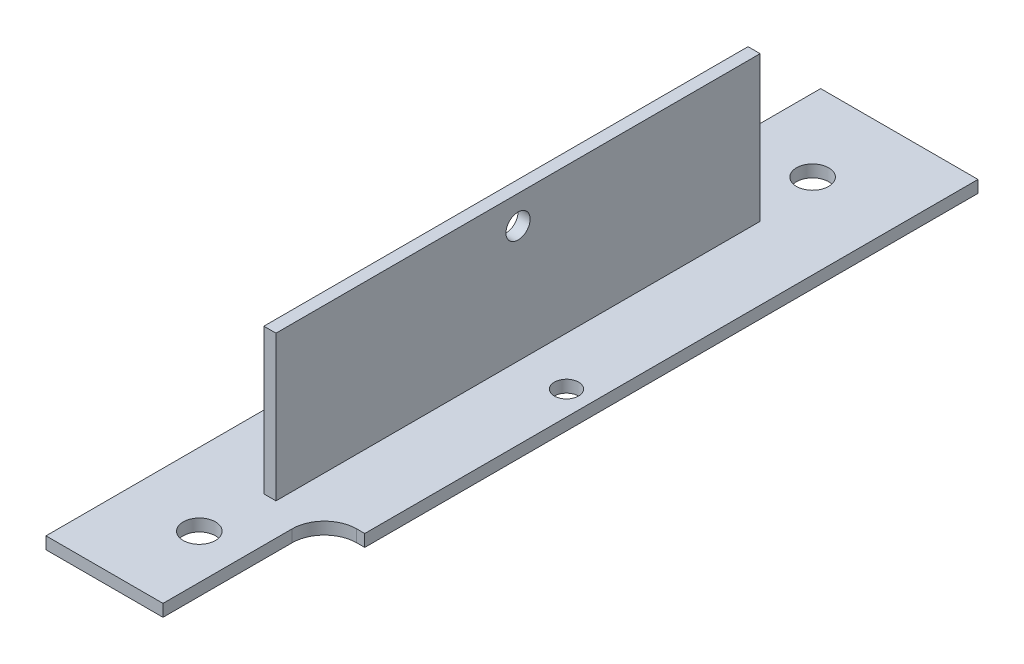
ISO-10303-21;
HEADER;
FILE_DESCRIPTION(('STEP AP214'),'2;1');
FILE_NAME('part.step','',(''),(''),'','','');
FILE_SCHEMA(('AUTOMOTIVE_DESIGN { 1 0 10303 214 1 1 1 1 }'));
ENDSEC;
DATA;
#1=APPLICATION_CONTEXT('core data for automotive mechanical design processes');
#2=APPLICATION_PROTOCOL_DEFINITION('international standard','automotive_design',2000,#1);
#3=PRODUCT_CONTEXT('',#1,'mechanical');
#4=PRODUCT('Part','Part','',(#3));
#5=PRODUCT_RELATED_PRODUCT_CATEGORY('part','',(#4));
#6=PRODUCT_DEFINITION_FORMATION('','',#4);
#7=PRODUCT_DEFINITION_CONTEXT('part definition',#1,'design');
#8=PRODUCT_DEFINITION('design','',#6,#7);
#9=PRODUCT_DEFINITION_SHAPE('','',#8);
#10=(LENGTH_UNIT() NAMED_UNIT(*) SI_UNIT(.MILLI.,.METRE.));
#11=(NAMED_UNIT(*) PLANE_ANGLE_UNIT() SI_UNIT($,.RADIAN.));
#12=(NAMED_UNIT(*) SI_UNIT($,.STERADIAN.) SOLID_ANGLE_UNIT());
#13=UNCERTAINTY_MEASURE_WITH_UNIT(LENGTH_MEASURE(1.E-05),#10,'distance_accuracy_value','');
#14=(GEOMETRIC_REPRESENTATION_CONTEXT(3) GLOBAL_UNCERTAINTY_ASSIGNED_CONTEXT((#13)) GLOBAL_UNIT_ASSIGNED_CONTEXT((#10,
#11,#12)) REPRESENTATION_CONTEXT('',''));
#15=CARTESIAN_POINT('',(0.,0.,0.));
#16=DIRECTION('',(0.,0.,1.));
#17=DIRECTION('',(1.,0.,0.));
#18=AXIS2_PLACEMENT_3D('',#15,#16,#17);
#19=CARTESIAN_POINT('',(-9.75,0.,96.));
#20=DIRECTION('',(0.,1.,0.));
#21=DIRECTION('',(0.,0.,1.));
#22=AXIS2_PLACEMENT_3D('',#19,#20,#21);
#23=PLANE('',#22);
#24=CARTESIAN_POINT('',(-0.750000000000001,0.,10.));
#25=DIRECTION('',(0.,1.,0.));
#26=DIRECTION('',(0.,0.,1.));
#27=AXIS2_PLACEMENT_3D('',#24,#25,#26);
#28=CIRCLE('',#27,2.);
#29=CARTESIAN_POINT('',(-0.750000000000001,0.,12.));
#30=VERTEX_POINT('',#29);
#31=EDGE_CURVE('E173',#30,#30,#28,.T.);
#32=ORIENTED_EDGE('',*,*,#31,.T.);
#33=EDGE_LOOP('',(#32));
#34=FACE_BOUND('',#33,.T.);
#35=CARTESIAN_POINT('',(-0.750000000000001,0.,86.));
#36=DIRECTION('',(0.,1.,0.));
#37=DIRECTION('',(0.,0.,1.));
#38=AXIS2_PLACEMENT_3D('',#35,#36,#37);
#39=CIRCLE('',#38,2.);
#40=CARTESIAN_POINT('',(-0.750000000000001,0.,88.));
#41=VERTEX_POINT('',#40);
#42=EDGE_CURVE('E170',#41,#41,#39,.T.);
#43=ORIENTED_EDGE('',*,*,#42,.T.);
#44=EDGE_LOOP('',(#43));
#45=FACE_BOUND('',#44,.T.);
#46=CARTESIAN_POINT('',(6.74999999999999,0.,48.));
#47=DIRECTION('',(0.,1.,0.));
#48=DIRECTION('',(0.,0.,1.));
#49=AXIS2_PLACEMENT_3D('',#46,#47,#48);
#50=CIRCLE('',#49,1.5);
#51=CARTESIAN_POINT('',(6.74999999999999,0.,49.5));
#52=VERTEX_POINT('',#51);
#53=EDGE_CURVE('E165',#52,#52,#50,.T.);
#54=ORIENTED_EDGE('',*,*,#53,.T.);
#55=EDGE_LOOP('',(#54));
#56=FACE_BOUND('',#55,.T.);
#57=DIRECTION('',(-1.,0.,0.));
#58=VECTOR('',#57,1.);
#59=CARTESIAN_POINT('',(-9.75,0.,76.));
#60=LINE('',#59,#58);
#61=CARTESIAN_POINT('',(9.75,0.,76.));
#62=VERTEX_POINT('',#61);
#63=CARTESIAN_POINT('',(8.75,0.,76.));
#64=VERTEX_POINT('',#63);
#65=EDGE_CURVE('E116',#62,#64,#60,.T.);
#66=ORIENTED_EDGE('',*,*,#65,.T.);
#67=CARTESIAN_POINT('',(8.75,0.,80.));
#68=DIRECTION('',(0.,1.,0.));
#69=DIRECTION('',(0.,0.,1.));
#70=AXIS2_PLACEMENT_3D('',#67,#68,#69);
#71=CIRCLE('',#70,4.);
#72=CARTESIAN_POINT('',(4.75,0.,80.));
#73=VERTEX_POINT('',#72);
#74=EDGE_CURVE('E11',#64,#73,#71,.T.);
#75=ORIENTED_EDGE('',*,*,#74,.T.);
#76=DIRECTION('',(0.,0.,1.));
#77=VECTOR('',#76,1.);
#78=CARTESIAN_POINT('',(4.75,0.,96.));
#79=LINE('',#78,#77);
#80=CARTESIAN_POINT('',(4.75,0.,96.));
#81=VERTEX_POINT('',#80);
#82=EDGE_CURVE('E153',#73,#81,#79,.T.);
#83=ORIENTED_EDGE('',*,*,#82,.T.);
#84=DIRECTION('',(1.,0.,0.));
#85=VECTOR('',#84,1.);
#86=CARTESIAN_POINT('',(-9.75,0.,96.));
#87=LINE('',#86,#85);
#88=CARTESIAN_POINT('',(-9.75,0.,96.));
#89=VERTEX_POINT('',#88);
#90=EDGE_CURVE('E215',#89,#81,#87,.T.);
#91=ORIENTED_EDGE('',*,*,#90,.F.);
#92=DIRECTION('',(0.,0.,-1.));
#93=VECTOR('',#92,1.);
#94=CARTESIAN_POINT('',(-9.75,0.,96.));
#95=LINE('',#94,#93);
#96=CARTESIAN_POINT('',(-9.75,0.,0.));
#97=VERTEX_POINT('',#96);
#98=EDGE_CURVE('E139',#89,#97,#95,.T.);
#99=ORIENTED_EDGE('',*,*,#98,.T.);
#100=DIRECTION('',(1.,0.,0.));
#101=VECTOR('',#100,1.);
#102=CARTESIAN_POINT('',(-9.75,0.,0.));
#103=LINE('',#102,#101);
#104=CARTESIAN_POINT('',(9.75,0.,0.));
#105=VERTEX_POINT('',#104);
#106=EDGE_CURVE('E214',#97,#105,#103,.T.);
#107=ORIENTED_EDGE('',*,*,#106,.T.);
#108=DIRECTION('',(0.,0.,-1.));
#109=VECTOR('',#108,1.);
#110=CARTESIAN_POINT('',(9.75,0.,96.));
#111=LINE('',#110,#109);
#112=EDGE_CURVE('E134',#62,#105,#111,.T.);
#113=ORIENTED_EDGE('',*,*,#112,.F.);
#114=EDGE_LOOP('',(#66,#75,#83,#91,#99,#107,#113));
#115=FACE_BOUND('',#114,.T.);
#116=ADVANCED_FACE('F33',(#34,#45,#56,#115),#23,.F.);
#117=CARTESIAN_POINT('',(9.75,1.5,96.));
#118=DIRECTION('',(1.,0.,0.));
#119=DIRECTION('',(0.,0.,-1.));
#120=AXIS2_PLACEMENT_3D('',#117,#118,#119);
#121=PLANE('',#120);
#122=DIRECTION('',(0.,1.,0.));
#123=VECTOR('',#122,1.);
#124=CARTESIAN_POINT('',(9.75,-1.5,76.));
#125=LINE('',#124,#123);
#126=CARTESIAN_POINT('',(9.75,1.5,76.));
#127=VERTEX_POINT('',#126);
#128=EDGE_CURVE('E113',#62,#127,#125,.T.);
#129=ORIENTED_EDGE('',*,*,#128,.F.);
#130=ORIENTED_EDGE('',*,*,#112,.T.);
#131=DIRECTION('',(0.,-1.,0.));
#132=VECTOR('',#131,1.);
#133=CARTESIAN_POINT('',(9.75,1.5,0.));
#134=LINE('',#133,#132);
#135=CARTESIAN_POINT('',(9.75,1.5,0.));
#136=VERTEX_POINT('',#135);
#137=EDGE_CURVE('E133',#136,#105,#134,.T.);
#138=ORIENTED_EDGE('',*,*,#137,.F.);
#139=DIRECTION('',(0.,0.,-1.));
#140=VECTOR('',#139,1.);
#141=CARTESIAN_POINT('',(9.75,1.5,96.));
#142=LINE('',#141,#140);
#143=EDGE_CURVE('E126',#127,#136,#142,.T.);
#144=ORIENTED_EDGE('',*,*,#143,.F.);
#145=EDGE_LOOP('',(#129,#130,#138,#144));
#146=FACE_BOUND('',#145,.T.);
#147=ADVANCED_FACE('F131',(#146),#121,.T.);
#148=CARTESIAN_POINT('',(-9.75,1.5,96.));
#149=DIRECTION('',(0.,1.,0.));
#150=DIRECTION('',(0.,0.,1.));
#151=AXIS2_PLACEMENT_3D('',#148,#149,#150);
#152=PLANE('',#151);
#153=CARTESIAN_POINT('',(-0.750000000000001,1.5,10.));
#154=DIRECTION('',(0.,1.,0.));
#155=DIRECTION('',(0.,0.,1.));
#156=AXIS2_PLACEMENT_3D('',#153,#154,#155);
#157=CIRCLE('',#156,2.);
#158=CARTESIAN_POINT('',(-0.750000000000001,1.5,12.));
#159=VERTEX_POINT('',#158);
#160=EDGE_CURVE('E166',#159,#159,#157,.T.);
#161=ORIENTED_EDGE('',*,*,#160,.F.);
#162=EDGE_LOOP('',(#161));
#163=FACE_BOUND('',#162,.T.);
#164=CARTESIAN_POINT('',(-0.750000000000001,1.5,86.));
#165=DIRECTION('',(0.,1.,0.));
#166=DIRECTION('',(0.,0.,-1.));
#167=AXIS2_PLACEMENT_3D('',#164,#165,#166);
#168=CIRCLE('',#167,2.);
#169=CARTESIAN_POINT('',(-0.750000000000001,1.5,84.));
#170=VERTEX_POINT('',#169);
#171=EDGE_CURVE('E120',#170,#170,#168,.T.);
#172=ORIENTED_EDGE('',*,*,#171,.F.);
#173=EDGE_LOOP('',(#172));
#174=FACE_BOUND('',#173,.T.);
#175=DIRECTION('',(0.,0.,1.));
#176=VECTOR('',#175,1.);
#177=CARTESIAN_POINT('',(4.75,1.5,96.));
#178=LINE('',#177,#176);
#179=CARTESIAN_POINT('',(4.75,1.5,80.));
#180=VERTEX_POINT('',#179);
#181=CARTESIAN_POINT('',(4.75,1.5,96.));
#182=VERTEX_POINT('',#181);
#183=EDGE_CURVE('E121',#180,#182,#178,.T.);
#184=ORIENTED_EDGE('',*,*,#183,.F.);
#185=CARTESIAN_POINT('',(8.75,1.5,80.));
#186=DIRECTION('',(0.,1.,0.));
#187=DIRECTION('',(0.,0.,1.));
#188=AXIS2_PLACEMENT_3D('',#185,#186,#187);
#189=CIRCLE('',#188,4.);
#190=CARTESIAN_POINT('',(8.75,1.5,76.));
#191=VERTEX_POINT('',#190);
#192=EDGE_CURVE('E41',#180,#191,#189,.F.);
#193=ORIENTED_EDGE('',*,*,#192,.T.);
#194=DIRECTION('',(-1.,0.,0.));
#195=VECTOR('',#194,1.);
#196=CARTESIAN_POINT('',(9.75,1.5,76.));
#197=LINE('',#196,#195);
#198=EDGE_CURVE('E115',#127,#191,#197,.T.);
#199=ORIENTED_EDGE('',*,*,#198,.F.);
#200=ORIENTED_EDGE('',*,*,#143,.T.);
#201=DIRECTION('',(1.,0.,0.));
#202=VECTOR('',#201,1.);
#203=CARTESIAN_POINT('',(-9.75,1.5,0.));
#204=LINE('',#203,#202);
#205=CARTESIAN_POINT('',(-9.75,1.5,0.));
#206=VERTEX_POINT('',#205);
#207=EDGE_CURVE('E226',#206,#136,#204,.T.);
#208=ORIENTED_EDGE('',*,*,#207,.F.);
#209=DIRECTION('',(0.,0.,-1.));
#210=VECTOR('',#209,1.);
#211=CARTESIAN_POINT('',(-9.75,1.5,96.));
#212=LINE('',#211,#210);
#213=CARTESIAN_POINT('',(-9.75,1.5,96.));
#214=VERTEX_POINT('',#213);
#215=EDGE_CURVE('E135',#214,#206,#212,.T.);
#216=ORIENTED_EDGE('',*,*,#215,.F.);
#217=DIRECTION('',(1.,0.,0.));
#218=VECTOR('',#217,1.);
#219=CARTESIAN_POINT('',(-9.75,1.5,96.));
#220=LINE('',#219,#218);
#221=EDGE_CURVE('E158',#214,#182,#220,.T.);
#222=ORIENTED_EDGE('',*,*,#221,.T.);
#223=EDGE_LOOP('',(#184,#193,#199,#200,#208,#216,#222));
#224=FACE_BOUND('',#223,.T.);
#225=CARTESIAN_POINT('',(6.74999999999999,1.5,48.));
#226=DIRECTION('',(0.,1.,0.));
#227=DIRECTION('',(0.,0.,1.));
#228=AXIS2_PLACEMENT_3D('',#225,#226,#227);
#229=CIRCLE('',#228,1.5);
#230=CARTESIAN_POINT('',(6.74999999999999,1.5,49.5));
#231=VERTEX_POINT('',#230);
#232=EDGE_CURVE('E128',#231,#231,#229,.T.);
#233=ORIENTED_EDGE('',*,*,#232,.F.);
#234=EDGE_LOOP('',(#233));
#235=FACE_BOUND('',#234,.T.);
#236=DIRECTION('',(0.,0.,1.));
#237=VECTOR('',#236,1.);
#238=CARTESIAN_POINT('',(0.750000000000001,1.5,96.));
#239=LINE('',#238,#237);
#240=CARTESIAN_POINT('',(0.75,1.5,18.));
#241=VERTEX_POINT('',#240);
#242=CARTESIAN_POINT('',(0.75,1.5,78.));
#243=VERTEX_POINT('',#242);
#244=EDGE_CURVE('E211',#241,#243,#239,.T.);
#245=ORIENTED_EDGE('',*,*,#244,.T.);
#246=DIRECTION('',(-1.,0.,0.));
#247=VECTOR('',#246,1.);
#248=CARTESIAN_POINT('',(2.25,1.5,78.));
#249=LINE('',#248,#247);
#250=CARTESIAN_POINT('',(-0.75,1.5,78.));
#251=VERTEX_POINT('',#250);
#252=EDGE_CURVE('E180',#243,#251,#249,.T.);
#253=ORIENTED_EDGE('',*,*,#252,.T.);
#254=DIRECTION('',(0.,0.,1.));
#255=VECTOR('',#254,1.);
#256=CARTESIAN_POINT('',(-0.750000000000001,1.5,96.));
#257=LINE('',#256,#255);
#258=CARTESIAN_POINT('',(-0.75,1.5,18.));
#259=VERTEX_POINT('',#258);
#260=EDGE_CURVE('E206',#259,#251,#257,.T.);
#261=ORIENTED_EDGE('',*,*,#260,.F.);
#262=DIRECTION('',(-1.,0.,0.));
#263=VECTOR('',#262,1.);
#264=CARTESIAN_POINT('',(2.25,1.5,18.));
#265=LINE('',#264,#263);
#266=EDGE_CURVE('E179',#241,#259,#265,.T.);
#267=ORIENTED_EDGE('',*,*,#266,.F.);
#268=EDGE_LOOP('',(#245,#253,#261,#267));
#269=FACE_BOUND('',#268,.T.);
#270=ADVANCED_FACE('F123',(#163,#174,#224,#235,#269),#152,.T.);
#271=CARTESIAN_POINT('',(-9.75,0.,96.));
#272=DIRECTION('',(-1.,0.,0.));
#273=DIRECTION('',(0.,0.,1.));
#274=AXIS2_PLACEMENT_3D('',#271,#272,#273);
#275=PLANE('',#274);
#276=DIRECTION('',(0.,1.,0.));
#277=VECTOR('',#276,1.);
#278=CARTESIAN_POINT('',(-9.75,0.,0.));
#279=LINE('',#278,#277);
#280=EDGE_CURVE('E218',#97,#206,#279,.T.);
#281=ORIENTED_EDGE('',*,*,#280,.F.);
#282=ORIENTED_EDGE('',*,*,#98,.F.);
#283=DIRECTION('',(0.,1.,0.));
#284=VECTOR('',#283,1.);
#285=CARTESIAN_POINT('',(-9.75,0.,96.));
#286=LINE('',#285,#284);
#287=EDGE_CURVE('E220',#89,#214,#286,.T.);
#288=ORIENTED_EDGE('',*,*,#287,.T.);
#289=ORIENTED_EDGE('',*,*,#215,.T.);
#290=EDGE_LOOP('',(#281,#282,#288,#289));
#291=FACE_BOUND('',#290,.T.);
#292=ADVANCED_FACE('F237',(#291),#275,.T.);
#293=CARTESIAN_POINT('',(0.,0.,96.));
#294=DIRECTION('',(0.,0.,-1.));
#295=DIRECTION('',(-1.,0.,0.));
#296=AXIS2_PLACEMENT_3D('',#293,#294,#295);
#297=PLANE('',#296);
#298=ORIENTED_EDGE('',*,*,#90,.T.);
#299=DIRECTION('',(0.,1.,0.));
#300=VECTOR('',#299,1.);
#301=CARTESIAN_POINT('',(4.75,0.,96.));
#302=LINE('',#301,#300);
#303=EDGE_CURVE('E137',#81,#182,#302,.T.);
#304=ORIENTED_EDGE('',*,*,#303,.T.);
#305=ORIENTED_EDGE('',*,*,#221,.F.);
#306=ORIENTED_EDGE('',*,*,#287,.F.);
#307=EDGE_LOOP('',(#298,#304,#305,#306));
#308=FACE_BOUND('',#307,.T.);
#309=ADVANCED_FACE('F239',(#308),#297,.F.);
#310=CARTESIAN_POINT('',(0.,0.,0.));
#311=DIRECTION('',(0.,0.,-1.));
#312=DIRECTION('',(-1.,0.,0.));
#313=AXIS2_PLACEMENT_3D('',#310,#311,#312);
#314=PLANE('',#313);
#315=ORIENTED_EDGE('',*,*,#207,.T.);
#316=ORIENTED_EDGE('',*,*,#137,.T.);
#317=ORIENTED_EDGE('',*,*,#106,.F.);
#318=ORIENTED_EDGE('',*,*,#280,.T.);
#319=EDGE_LOOP('',(#315,#316,#317,#318));
#320=FACE_BOUND('',#319,.T.);
#321=ADVANCED_FACE('F236',(#320),#314,.T.);
#322=CARTESIAN_POINT('',(0.75,19.5,115.557607215608));
#323=DIRECTION('',(0.,-1.,0.));
#324=DIRECTION('',(0.,0.,-1.));
#325=AXIS2_PLACEMENT_3D('',#322,#323,#324);
#326=PLANE('',#325);
#327=DIRECTION('',(0.,0.,-1.));
#328=VECTOR('',#327,1.);
#329=CARTESIAN_POINT('',(-0.75,19.5,115.557607215608));
#330=LINE('',#329,#328);
#331=CARTESIAN_POINT('',(-0.75,19.5,78.));
#332=VERTEX_POINT('',#331);
#333=CARTESIAN_POINT('',(-0.75,19.5,18.));
#334=VERTEX_POINT('',#333);
#335=EDGE_CURVE('E202',#332,#334,#330,.T.);
#336=ORIENTED_EDGE('',*,*,#335,.F.);
#337=DIRECTION('',(-1.,0.,0.));
#338=VECTOR('',#337,1.);
#339=CARTESIAN_POINT('',(2.25,19.5,78.));
#340=LINE('',#339,#338);
#341=CARTESIAN_POINT('',(0.75,19.5,78.));
#342=VERTEX_POINT('',#341);
#343=EDGE_CURVE('E188',#342,#332,#340,.T.);
#344=ORIENTED_EDGE('',*,*,#343,.F.);
#345=DIRECTION('',(0.,0.,-1.));
#346=VECTOR('',#345,1.);
#347=CARTESIAN_POINT('',(0.75,19.5,115.557607215608));
#348=LINE('',#347,#346);
#349=CARTESIAN_POINT('',(0.75,19.5,18.));
#350=VERTEX_POINT('',#349);
#351=EDGE_CURVE('E203',#342,#350,#348,.T.);
#352=ORIENTED_EDGE('',*,*,#351,.T.);
#353=DIRECTION('',(-1.,0.,0.));
#354=VECTOR('',#353,1.);
#355=CARTESIAN_POINT('',(2.25,19.5,18.));
#356=LINE('',#355,#354);
#357=EDGE_CURVE('E181',#350,#334,#356,.T.);
#358=ORIENTED_EDGE('',*,*,#357,.T.);
#359=EDGE_LOOP('',(#336,#344,#352,#358));
#360=FACE_BOUND('',#359,.T.);
#361=ADVANCED_FACE('F246',(#360),#326,.F.);
#362=CARTESIAN_POINT('',(0.75,0.,115.557607215608));
#363=DIRECTION('',(-1.,0.,0.));
#364=DIRECTION('',(0.,0.,1.));
#365=AXIS2_PLACEMENT_3D('',#362,#363,#364);
#366=PLANE('',#365);
#367=CARTESIAN_POINT('',(0.75,16.,48.));
#368=DIRECTION('',(-1.,0.,0.));
#369=DIRECTION('',(0.,0.,1.));
#370=AXIS2_PLACEMENT_3D('',#367,#368,#369);
#371=CIRCLE('',#370,1.5);
#372=CARTESIAN_POINT('',(0.75,16.,49.5));
#373=VERTEX_POINT('',#372);
#374=EDGE_CURVE('E193',#373,#373,#371,.T.);
#375=ORIENTED_EDGE('',*,*,#374,.T.);
#376=EDGE_LOOP('',(#375));
#377=FACE_BOUND('',#376,.T.);
#378=ORIENTED_EDGE('',*,*,#351,.F.);
#379=DIRECTION('',(0.,-1.,0.));
#380=VECTOR('',#379,1.);
#381=CARTESIAN_POINT('',(0.75,0.,78.));
#382=LINE('',#381,#380);
#383=EDGE_CURVE('E199',#342,#243,#382,.T.);
#384=ORIENTED_EDGE('',*,*,#383,.T.);
#385=ORIENTED_EDGE('',*,*,#244,.F.);
#386=DIRECTION('',(0.,1.,0.));
#387=VECTOR('',#386,1.);
#388=CARTESIAN_POINT('',(0.75,0.,18.));
#389=LINE('',#388,#387);
#390=EDGE_CURVE('E196',#241,#350,#389,.T.);
#391=ORIENTED_EDGE('',*,*,#390,.T.);
#392=EDGE_LOOP('',(#378,#384,#385,#391));
#393=FACE_BOUND('',#392,.T.);
#394=ADVANCED_FACE('F303',(#377,#393),#366,.F.);
#395=CARTESIAN_POINT('',(-0.75,0.,115.557607215608));
#396=DIRECTION('',(-1.,0.,0.));
#397=DIRECTION('',(0.,0.,1.));
#398=AXIS2_PLACEMENT_3D('',#395,#396,#397);
#399=PLANE('',#398);
#400=DIRECTION('',(0.,-1.,0.));
#401=VECTOR('',#400,1.);
#402=CARTESIAN_POINT('',(-0.75,1.5,78.));
#403=LINE('',#402,#401);
#404=EDGE_CURVE('E176',#332,#251,#403,.T.);
#405=ORIENTED_EDGE('',*,*,#404,.F.);
#406=ORIENTED_EDGE('',*,*,#335,.T.);
#407=DIRECTION('',(0.,1.,0.));
#408=VECTOR('',#407,1.);
#409=CARTESIAN_POINT('',(-0.75,1.5,18.));
#410=LINE('',#409,#408);
#411=EDGE_CURVE('E177',#259,#334,#410,.T.);
#412=ORIENTED_EDGE('',*,*,#411,.F.);
#413=ORIENTED_EDGE('',*,*,#260,.T.);
#414=EDGE_LOOP('',(#405,#406,#412,#413));
#415=FACE_BOUND('',#414,.T.);
#416=CARTESIAN_POINT('',(-0.75,16.,48.));
#417=DIRECTION('',(-1.,0.,0.));
#418=DIRECTION('',(0.,0.,1.));
#419=AXIS2_PLACEMENT_3D('',#416,#417,#418);
#420=CIRCLE('',#419,1.5);
#421=CARTESIAN_POINT('',(-0.75,16.,49.5));
#422=VERTEX_POINT('',#421);
#423=EDGE_CURVE('E184',#422,#422,#420,.T.);
#424=ORIENTED_EDGE('',*,*,#423,.F.);
#425=EDGE_LOOP('',(#424));
#426=FACE_BOUND('',#425,.T.);
#427=ADVANCED_FACE('F301',(#415,#426),#399,.T.);
#428=CARTESIAN_POINT('',(2.25,16.,48.));
#429=DIRECTION('',(-1.,0.,0.));
#430=DIRECTION('',(0.,0.,1.));
#431=AXIS2_PLACEMENT_3D('',#428,#429,#430);
#432=CYLINDRICAL_SURFACE('',#431,1.5);
#433=ORIENTED_EDGE('',*,*,#423,.T.);
#434=EDGE_LOOP('',(#433));
#435=FACE_BOUND('',#434,.T.);
#436=ORIENTED_EDGE('',*,*,#374,.F.);
#437=EDGE_LOOP('',(#436));
#438=FACE_BOUND('',#437,.T.);
#439=ADVANCED_FACE('F294',(#435,#438),#432,.F.);
#440=CARTESIAN_POINT('',(2.25,1.5,18.));
#441=DIRECTION('',(0.,0.,1.));
#442=DIRECTION('',(1.,0.,0.));
#443=AXIS2_PLACEMENT_3D('',#440,#441,#442);
#444=PLANE('',#443);
#445=ORIENTED_EDGE('',*,*,#266,.T.);
#446=ORIENTED_EDGE('',*,*,#411,.T.);
#447=ORIENTED_EDGE('',*,*,#357,.F.);
#448=ORIENTED_EDGE('',*,*,#390,.F.);
#449=EDGE_LOOP('',(#445,#446,#447,#448));
#450=FACE_BOUND('',#449,.T.);
#451=ADVANCED_FACE('F291',(#450),#444,.F.);
#452=CARTESIAN_POINT('',(2.25,1.5,78.));
#453=DIRECTION('',(0.,0.,-1.));
#454=DIRECTION('',(-1.,0.,0.));
#455=AXIS2_PLACEMENT_3D('',#452,#453,#454);
#456=PLANE('',#455);
#457=ORIENTED_EDGE('',*,*,#343,.T.);
#458=ORIENTED_EDGE('',*,*,#404,.T.);
#459=ORIENTED_EDGE('',*,*,#252,.F.);
#460=ORIENTED_EDGE('',*,*,#383,.F.);
#461=EDGE_LOOP('',(#457,#458,#459,#460));
#462=FACE_BOUND('',#461,.T.);
#463=ADVANCED_FACE('F287',(#462),#456,.F.);
#464=CARTESIAN_POINT('',(9.75,-1.5,76.));
#465=DIRECTION('',(0.,0.,-1.));
#466=DIRECTION('',(-1.,0.,0.));
#467=AXIS2_PLACEMENT_3D('',#464,#465,#466);
#468=PLANE('',#467);
#469=ORIENTED_EDGE('',*,*,#198,.T.);
#470=DIRECTION('',(0.,1.,0.));
#471=VECTOR('',#470,1.);
#472=CARTESIAN_POINT('',(8.75,0.,76.));
#473=LINE('',#472,#471);
#474=EDGE_CURVE('E48',#191,#64,#473,.F.);
#475=ORIENTED_EDGE('',*,*,#474,.T.);
#476=ORIENTED_EDGE('',*,*,#65,.F.);
#477=ORIENTED_EDGE('',*,*,#128,.T.);
#478=EDGE_LOOP('',(#469,#475,#476,#477));
#479=FACE_BOUND('',#478,.T.);
#480=ADVANCED_FACE('F114',(#479),#468,.F.);
#481=CARTESIAN_POINT('',(4.75,-1.5,96.));
#482=DIRECTION('',(-1.,0.,0.));
#483=DIRECTION('',(0.,0.,1.));
#484=AXIS2_PLACEMENT_3D('',#481,#482,#483);
#485=PLANE('',#484);
#486=ORIENTED_EDGE('',*,*,#82,.F.);
#487=DIRECTION('',(0.,1.,0.));
#488=VECTOR('',#487,1.);
#489=CARTESIAN_POINT('',(4.75,1.5,80.));
#490=LINE('',#489,#488);
#491=EDGE_CURVE('E145',#73,#180,#490,.T.);
#492=ORIENTED_EDGE('',*,*,#491,.T.);
#493=ORIENTED_EDGE('',*,*,#183,.T.);
#494=ORIENTED_EDGE('',*,*,#303,.F.);
#495=EDGE_LOOP('',(#486,#492,#493,#494));
#496=FACE_BOUND('',#495,.T.);
#497=ADVANCED_FACE('F151',(#496),#485,.F.);
#498=CARTESIAN_POINT('',(6.74999999999999,-1.5,48.));
#499=DIRECTION('',(0.,1.,0.));
#500=DIRECTION('',(0.,0.,1.));
#501=AXIS2_PLACEMENT_3D('',#498,#499,#500);
#502=CYLINDRICAL_SURFACE('',#501,1.5);
#503=ORIENTED_EDGE('',*,*,#232,.T.);
#504=EDGE_LOOP('',(#503));
#505=FACE_BOUND('',#504,.T.);
#506=ORIENTED_EDGE('',*,*,#53,.F.);
#507=EDGE_LOOP('',(#506));
#508=FACE_BOUND('',#507,.T.);
#509=ADVANCED_FACE('F280',(#505,#508),#502,.F.);
#510=CARTESIAN_POINT('',(-0.750000000000001,-1.5,86.));
#511=DIRECTION('',(0.,1.,0.));
#512=DIRECTION('',(0.,0.,1.));
#513=AXIS2_PLACEMENT_3D('',#510,#511,#512);
#514=CYLINDRICAL_SURFACE('',#513,2.);
#515=ORIENTED_EDGE('',*,*,#171,.T.);
#516=EDGE_LOOP('',(#515));
#517=FACE_BOUND('',#516,.T.);
#518=ORIENTED_EDGE('',*,*,#42,.F.);
#519=EDGE_LOOP('',(#518));
#520=FACE_BOUND('',#519,.T.);
#521=ADVANCED_FACE('F273',(#517,#520),#514,.F.);
#522=CARTESIAN_POINT('',(-0.750000000000001,-1.5,10.));
#523=DIRECTION('',(0.,1.,0.));
#524=DIRECTION('',(0.,0.,1.));
#525=AXIS2_PLACEMENT_3D('',#522,#523,#524);
#526=CYLINDRICAL_SURFACE('',#525,2.);
#527=ORIENTED_EDGE('',*,*,#160,.T.);
#528=EDGE_LOOP('',(#527));
#529=FACE_BOUND('',#528,.T.);
#530=ORIENTED_EDGE('',*,*,#31,.F.);
#531=EDGE_LOOP('',(#530));
#532=FACE_BOUND('',#531,.T.);
#533=ADVANCED_FACE('F270',(#529,#532),#526,.F.);
#534=CARTESIAN_POINT('',(8.75,-1.5,80.));
#535=DIRECTION('',(0.,-1.,0.));
#536=DIRECTION('',(0.,0.,-1.));
#537=AXIS2_PLACEMENT_3D('',#534,#535,#536);
#538=CYLINDRICAL_SURFACE('',#537,4.);
#539=ORIENTED_EDGE('',*,*,#74,.F.);
#540=ORIENTED_EDGE('',*,*,#474,.F.);
#541=ORIENTED_EDGE('',*,*,#192,.F.);
#542=ORIENTED_EDGE('',*,*,#491,.F.);
#543=EDGE_LOOP('',(#539,#540,#541,#542));
#544=FACE_BOUND('',#543,.T.);
#545=ADVANCED_FACE('F35',(#544),#538,.F.);
#546=CLOSED_SHELL('',(#116,#147,#270,#292,#309,#321,#361,#394,#427,#439,#451,#463,#480,#497,
#509,#521,#533,#545));
#547=MANIFOLD_SOLID_BREP('B2',#546);
#548=ADVANCED_BREP_SHAPE_REPRESENTATION('',(#18,#547),#14);
#549=SHAPE_DEFINITION_REPRESENTATION(#9,#548);
ENDSEC;
END-ISO-10303-21;
